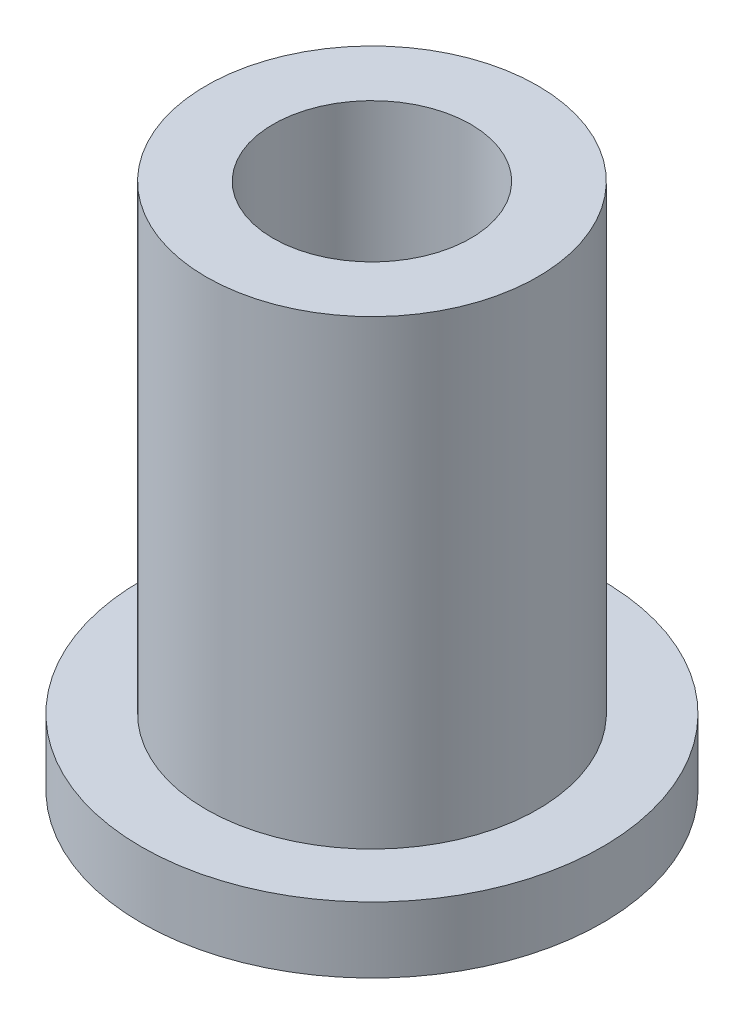
ISO-10303-21;
HEADER;
FILE_DESCRIPTION(('STEP AP214'),'2;1');
FILE_NAME('part.step','',(''),(''),'','','');
FILE_SCHEMA(('AUTOMOTIVE_DESIGN { 1 0 10303 214 1 1 1 1 }'));
ENDSEC;
DATA;
#1=APPLICATION_CONTEXT('core data for automotive mechanical design processes');
#2=APPLICATION_PROTOCOL_DEFINITION('international standard','automotive_design',2000,#1);
#3=PRODUCT_CONTEXT('',#1,'mechanical');
#4=PRODUCT('Part','Part','',(#3));
#5=PRODUCT_RELATED_PRODUCT_CATEGORY('part','',(#4));
#6=PRODUCT_DEFINITION_FORMATION('','',#4);
#7=PRODUCT_DEFINITION_CONTEXT('part definition',#1,'design');
#8=PRODUCT_DEFINITION('design','',#6,#7);
#9=PRODUCT_DEFINITION_SHAPE('','',#8);
#10=(LENGTH_UNIT() NAMED_UNIT(*) SI_UNIT(.MILLI.,.METRE.));
#11=(NAMED_UNIT(*) PLANE_ANGLE_UNIT() SI_UNIT($,.RADIAN.));
#12=(NAMED_UNIT(*) SI_UNIT($,.STERADIAN.) SOLID_ANGLE_UNIT());
#13=UNCERTAINTY_MEASURE_WITH_UNIT(LENGTH_MEASURE(1.E-05),#10,'distance_accuracy_value','');
#14=(GEOMETRIC_REPRESENTATION_CONTEXT(3) GLOBAL_UNCERTAINTY_ASSIGNED_CONTEXT((#13)) GLOBAL_UNIT_ASSIGNED_CONTEXT((#10,
#11,#12)) REPRESENTATION_CONTEXT('',''));
#15=CARTESIAN_POINT('',(0.,0.,0.));
#16=DIRECTION('',(0.,0.,1.));
#17=DIRECTION('',(1.,0.,0.));
#18=AXIS2_PLACEMENT_3D('',#15,#16,#17);
#19=CARTESIAN_POINT('',(0.,1.5875,0.));
#20=DIRECTION('',(0.,-1.,0.));
#21=DIRECTION('',(0.,0.,-1.));
#22=AXIS2_PLACEMENT_3D('',#19,#20,#21);
#23=CYLINDRICAL_SURFACE('',#22,5.55625);
#24=CARTESIAN_POINT('',(0.,1.5875,0.));
#25=DIRECTION('',(0.,1.,0.));
#26=DIRECTION('',(0.,0.,1.));
#27=AXIS2_PLACEMENT_3D('',#24,#25,#26);
#28=CIRCLE('',#27,5.55625);
#29=CARTESIAN_POINT('',(0.,1.5875,5.55625));
#30=VERTEX_POINT('',#29);
#31=EDGE_CURVE('E51',#30,#30,#28,.T.);
#32=ORIENTED_EDGE('',*,*,#31,.F.);
#33=EDGE_LOOP('',(#32));
#34=FACE_BOUND('',#33,.T.);
#35=CARTESIAN_POINT('',(0.,0.,0.));
#36=DIRECTION('',(0.,1.,0.));
#37=DIRECTION('',(0.,0.,1.));
#38=AXIS2_PLACEMENT_3D('',#35,#36,#37);
#39=CIRCLE('',#38,5.55625);
#40=CARTESIAN_POINT('',(0.,0.,5.55625));
#41=VERTEX_POINT('',#40);
#42=EDGE_CURVE('E46',#41,#41,#39,.T.);
#43=ORIENTED_EDGE('',*,*,#42,.T.);
#44=EDGE_LOOP('',(#43));
#45=FACE_BOUND('',#44,.T.);
#46=ADVANCED_FACE('F43',(#34,#45),#23,.T.);
#47=CARTESIAN_POINT('',(0.,1.5875,0.));
#48=DIRECTION('',(0.,1.,0.));
#49=DIRECTION('',(0.,0.,1.));
#50=AXIS2_PLACEMENT_3D('',#47,#48,#49);
#51=PLANE('',#50);
#52=CARTESIAN_POINT('',(0.,1.5875,0.));
#53=DIRECTION('',(0.,1.,0.));
#54=DIRECTION('',(0.,0.,1.));
#55=AXIS2_PLACEMENT_3D('',#52,#53,#54);
#56=CIRCLE('',#55,3.99415);
#57=CARTESIAN_POINT('',(0.,1.5875,3.99415));
#58=VERTEX_POINT('',#57);
#59=EDGE_CURVE('E10',#58,#58,#56,.T.);
#60=ORIENTED_EDGE('',*,*,#59,.F.);
#61=EDGE_LOOP('',(#60));
#62=FACE_BOUND('',#61,.T.);
#63=ORIENTED_EDGE('',*,*,#31,.T.);
#64=EDGE_LOOP('',(#63));
#65=FACE_BOUND('',#64,.T.);
#66=ADVANCED_FACE('F86',(#62,#65),#51,.T.);
#67=CARTESIAN_POINT('',(0.,0.,0.));
#68=DIRECTION('',(0.,1.,0.));
#69=DIRECTION('',(0.,0.,1.));
#70=AXIS2_PLACEMENT_3D('',#67,#68,#69);
#71=PLANE('',#70);
#72=CARTESIAN_POINT('',(0.,0.,0.));
#73=DIRECTION('',(0.,1.,0.));
#74=DIRECTION('',(0.,0.,1.));
#75=AXIS2_PLACEMENT_3D('',#72,#73,#74);
#76=CIRCLE('',#75,2.38125);
#77=CARTESIAN_POINT('',(0.,0.,2.38125));
#78=VERTEX_POINT('',#77);
#79=EDGE_CURVE('E62',#78,#78,#76,.F.);
#80=ORIENTED_EDGE('',*,*,#79,.F.);
#81=EDGE_LOOP('',(#80));
#82=FACE_BOUND('',#81,.T.);
#83=ORIENTED_EDGE('',*,*,#42,.F.);
#84=EDGE_LOOP('',(#83));
#85=FACE_BOUND('',#84,.T.);
#86=ADVANCED_FACE('F81',(#82,#85),#71,.F.);
#87=CARTESIAN_POINT('',(0.,12.7,0.));
#88=DIRECTION('',(0.,-1.,0.));
#89=DIRECTION('',(0.,0.,-1.));
#90=AXIS2_PLACEMENT_3D('',#87,#88,#89);
#91=CYLINDRICAL_SURFACE('',#90,3.99415);
#92=CARTESIAN_POINT('',(0.,12.7,0.));
#93=DIRECTION('',(0.,1.,0.));
#94=DIRECTION('',(0.,0.,1.));
#95=AXIS2_PLACEMENT_3D('',#92,#93,#94);
#96=CIRCLE('',#95,3.99415);
#97=CARTESIAN_POINT('',(0.,12.7,3.99415));
#98=VERTEX_POINT('',#97);
#99=EDGE_CURVE('E58',#98,#98,#96,.T.);
#100=ORIENTED_EDGE('',*,*,#99,.F.);
#101=EDGE_LOOP('',(#100));
#102=FACE_BOUND('',#101,.T.);
#103=ORIENTED_EDGE('',*,*,#59,.T.);
#104=EDGE_LOOP('',(#103));
#105=FACE_BOUND('',#104,.T.);
#106=ADVANCED_FACE('F76',(#102,#105),#91,.T.);
#107=CARTESIAN_POINT('',(0.,12.7,0.));
#108=DIRECTION('',(0.,1.,0.));
#109=DIRECTION('',(0.,0.,1.));
#110=AXIS2_PLACEMENT_3D('',#107,#108,#109);
#111=PLANE('',#110);
#112=CARTESIAN_POINT('',(0.,12.7,0.));
#113=DIRECTION('',(0.,1.,0.));
#114=DIRECTION('',(0.,0.,1.));
#115=AXIS2_PLACEMENT_3D('',#112,#113,#114);
#116=CIRCLE('',#115,2.38125);
#117=CARTESIAN_POINT('',(0.,12.7,2.38125));
#118=VERTEX_POINT('',#117);
#119=EDGE_CURVE('E66',#118,#118,#116,.T.);
#120=ORIENTED_EDGE('',*,*,#119,.F.);
#121=EDGE_LOOP('',(#120));
#122=FACE_BOUND('',#121,.T.);
#123=ORIENTED_EDGE('',*,*,#99,.T.);
#124=EDGE_LOOP('',(#123));
#125=FACE_BOUND('',#124,.T.);
#126=ADVANCED_FACE('F73',(#122,#125),#111,.T.);
#127=CARTESIAN_POINT('',(0.,-6.73519209080187,0.));
#128=DIRECTION('',(0.,1.,0.));
#129=DIRECTION('',(0.,0.,1.));
#130=AXIS2_PLACEMENT_3D('',#127,#128,#129);
#131=CYLINDRICAL_SURFACE('',#130,2.38125);
#132=ORIENTED_EDGE('',*,*,#79,.T.);
#133=EDGE_LOOP('',(#132));
#134=FACE_BOUND('',#133,.T.);
#135=ORIENTED_EDGE('',*,*,#119,.T.);
#136=EDGE_LOOP('',(#135));
#137=FACE_BOUND('',#136,.T.);
#138=ADVANCED_FACE('F71',(#134,#137),#131,.F.);
#139=CLOSED_SHELL('',(#46,#66,#86,#106,#126,#138));
#140=MANIFOLD_SOLID_BREP('B2',#139);
#141=ADVANCED_BREP_SHAPE_REPRESENTATION('',(#18,#140),#14);
#142=SHAPE_DEFINITION_REPRESENTATION(#9,#141);
ENDSEC;
END-ISO-10303-21;
